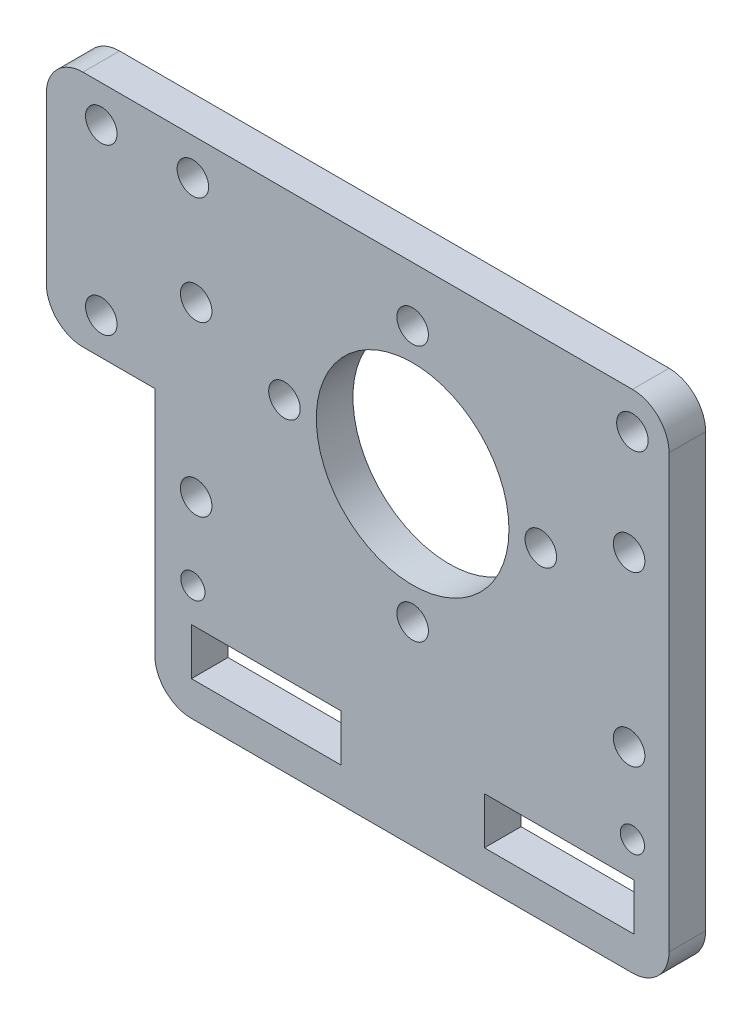
ISO-10303-21;
HEADER;
FILE_DESCRIPTION(('STEP AP214'),'2;1');
FILE_NAME('part.step','',(''),(''),'','','');
FILE_SCHEMA(('AUTOMOTIVE_DESIGN { 1 0 10303 214 1 1 1 1 }'));
ENDSEC;
DATA;
#1=APPLICATION_CONTEXT('core data for automotive mechanical design processes');
#2=APPLICATION_PROTOCOL_DEFINITION('international standard','automotive_design',2000,#1);
#3=PRODUCT_CONTEXT('',#1,'mechanical');
#4=PRODUCT('Part','Part','',(#3));
#5=PRODUCT_RELATED_PRODUCT_CATEGORY('part','',(#4));
#6=PRODUCT_DEFINITION_FORMATION('','',#4);
#7=PRODUCT_DEFINITION_CONTEXT('part definition',#1,'design');
#8=PRODUCT_DEFINITION('design','',#6,#7);
#9=PRODUCT_DEFINITION_SHAPE('','',#8);
#10=(LENGTH_UNIT() NAMED_UNIT(*) SI_UNIT(.MILLI.,.METRE.));
#11=(NAMED_UNIT(*) PLANE_ANGLE_UNIT() SI_UNIT($,.RADIAN.));
#12=(NAMED_UNIT(*) SI_UNIT($,.STERADIAN.) SOLID_ANGLE_UNIT());
#13=UNCERTAINTY_MEASURE_WITH_UNIT(LENGTH_MEASURE(1.E-05),#10,'distance_accuracy_value','');
#14=(GEOMETRIC_REPRESENTATION_CONTEXT(3) GLOBAL_UNCERTAINTY_ASSIGNED_CONTEXT((#13)) GLOBAL_UNIT_ASSIGNED_CONTEXT((#10,
#11,#12)) REPRESENTATION_CONTEXT('',''));
#15=CARTESIAN_POINT('',(0.,0.,0.));
#16=DIRECTION('',(0.,0.,1.));
#17=DIRECTION('',(1.,0.,0.));
#18=AXIS2_PLACEMENT_3D('',#15,#16,#17);
#19=CARTESIAN_POINT('',(0.,-44.,5.));
#20=DIRECTION('',(0.,1.,0.));
#21=DIRECTION('',(0.,0.,1.));
#22=AXIS2_PLACEMENT_3D('',#19,#20,#21);
#23=PLANE('',#22);
#24=DIRECTION('',(1.,0.,0.));
#25=VECTOR('',#24,1.);
#26=CARTESIAN_POINT('',(0.,-44.,5.));
#27=LINE('',#26,#25);
#28=CARTESIAN_POINT('',(-30.2,-44.,5.));
#29=VERTEX_POINT('',#28);
#30=CARTESIAN_POINT('',(30.,-44.,5.));
#31=VERTEX_POINT('',#30);
#32=EDGE_CURVE('E278',#29,#31,#27,.T.);
#33=ORIENTED_EDGE('',*,*,#32,.F.);
#34=DIRECTION('',(0.,0.,1.));
#35=VECTOR('',#34,1.);
#36=CARTESIAN_POINT('',(-30.2,-44.,5.));
#37=LINE('',#36,#35);
#38=CARTESIAN_POINT('',(-30.2,-44.,0.));
#39=VERTEX_POINT('',#38);
#40=EDGE_CURVE('E463',#29,#39,#37,.F.);
#41=ORIENTED_EDGE('',*,*,#40,.T.);
#42=DIRECTION('',(1.,0.,0.));
#43=VECTOR('',#42,1.);
#44=CARTESIAN_POINT('',(0.,-44.,0.));
#45=LINE('',#44,#43);
#46=CARTESIAN_POINT('',(30.,-44.,0.));
#47=VERTEX_POINT('',#46);
#48=EDGE_CURVE('E386',#39,#47,#45,.T.);
#49=ORIENTED_EDGE('',*,*,#48,.T.);
#50=DIRECTION('',(0.,0.,-1.));
#51=VECTOR('',#50,1.);
#52=CARTESIAN_POINT('',(30.,-44.,5.));
#53=LINE('',#52,#51);
#54=EDGE_CURVE('E460',#47,#31,#53,.F.);
#55=ORIENTED_EDGE('',*,*,#54,.T.);
#56=EDGE_LOOP('',(#33,#41,#49,#55));
#57=FACE_BOUND('',#56,.T.);
#58=ADVANCED_FACE('F41',(#57),#23,.F.);
#59=CARTESIAN_POINT('',(35.,0.,5.));
#60=DIRECTION('',(-1.,0.,0.));
#61=DIRECTION('',(0.,-1.,0.));
#62=AXIS2_PLACEMENT_3D('',#59,#60,#61);
#63=PLANE('',#62);
#64=DIRECTION('',(0.,1.,0.));
#65=VECTOR('',#64,1.);
#66=CARTESIAN_POINT('',(35.,0.,5.));
#67=LINE('',#66,#65);
#68=CARTESIAN_POINT('',(35.,-39.,5.));
#69=VERTEX_POINT('',#68);
#70=CARTESIAN_POINT('',(35.,20.,5.));
#71=VERTEX_POINT('',#70);
#72=EDGE_CURVE('E282',#69,#71,#67,.T.);
#73=ORIENTED_EDGE('',*,*,#72,.F.);
#74=DIRECTION('',(0.,0.,-1.));
#75=VECTOR('',#74,1.);
#76=CARTESIAN_POINT('',(35.,-39.,5.));
#77=LINE('',#76,#75);
#78=CARTESIAN_POINT('',(35.,-39.,0.));
#79=VERTEX_POINT('',#78);
#80=EDGE_CURVE('E482',#69,#79,#77,.T.);
#81=ORIENTED_EDGE('',*,*,#80,.T.);
#82=DIRECTION('',(0.,1.,0.));
#83=VECTOR('',#82,1.);
#84=CARTESIAN_POINT('',(35.,0.,0.));
#85=LINE('',#84,#83);
#86=CARTESIAN_POINT('',(35.,20.,0.));
#87=VERTEX_POINT('',#86);
#88=EDGE_CURVE('E390',#79,#87,#85,.T.);
#89=ORIENTED_EDGE('',*,*,#88,.T.);
#90=DIRECTION('',(0.,0.,-1.));
#91=VECTOR('',#90,1.);
#92=CARTESIAN_POINT('',(35.,20.,5.));
#93=LINE('',#92,#91);
#94=EDGE_CURVE('E479',#87,#71,#93,.F.);
#95=ORIENTED_EDGE('',*,*,#94,.T.);
#96=EDGE_LOOP('',(#73,#81,#89,#95));
#97=FACE_BOUND('',#96,.T.);
#98=ADVANCED_FACE('F522',(#97),#63,.F.);
#99=CARTESIAN_POINT('',(0.,25.,5.));
#100=DIRECTION('',(0.,1.,0.));
#101=DIRECTION('',(0.,0.,1.));
#102=AXIS2_PLACEMENT_3D('',#99,#100,#101);
#103=PLANE('',#102);
#104=DIRECTION('',(1.,0.,0.));
#105=VECTOR('',#104,1.);
#106=CARTESIAN_POINT('',(0.,25.,5.));
#107=LINE('',#106,#105);
#108=CARTESIAN_POINT('',(-45.,25.,5.));
#109=VERTEX_POINT('',#108);
#110=CARTESIAN_POINT('',(30.,25.,5.));
#111=VERTEX_POINT('',#110);
#112=EDGE_CURVE('E286',#109,#111,#107,.T.);
#113=ORIENTED_EDGE('',*,*,#112,.T.);
#114=DIRECTION('',(0.,0.,-1.));
#115=VECTOR('',#114,1.);
#116=CARTESIAN_POINT('',(30.,25.,0.));
#117=LINE('',#116,#115);
#118=CARTESIAN_POINT('',(30.,25.,0.));
#119=VERTEX_POINT('',#118);
#120=EDGE_CURVE('E488',#111,#119,#117,.T.);
#121=ORIENTED_EDGE('',*,*,#120,.T.);
#122=DIRECTION('',(1.,0.,0.));
#123=VECTOR('',#122,1.);
#124=CARTESIAN_POINT('',(0.,25.,0.));
#125=LINE('',#124,#123);
#126=CARTESIAN_POINT('',(-45.,25.,0.));
#127=VERTEX_POINT('',#126);
#128=EDGE_CURVE('E393',#127,#119,#125,.T.);
#129=ORIENTED_EDGE('',*,*,#128,.F.);
#130=DIRECTION('',(0.,0.,-1.));
#131=VECTOR('',#130,1.);
#132=CARTESIAN_POINT('',(-45.,25.,5.));
#133=LINE('',#132,#131);
#134=EDGE_CURVE('E485',#127,#109,#133,.F.);
#135=ORIENTED_EDGE('',*,*,#134,.T.);
#136=EDGE_LOOP('',(#113,#121,#129,#135));
#137=FACE_BOUND('',#136,.T.);
#138=ADVANCED_FACE('F514',(#137),#103,.T.);
#139=CARTESIAN_POINT('',(0.,-32.9,5.));
#140=DIRECTION('',(0.,-1.,0.));
#141=DIRECTION('',(1.,0.,0.));
#142=AXIS2_PLACEMENT_3D('',#139,#140,#141);
#143=PLANE('',#142);
#144=DIRECTION('',(-1.,0.,0.));
#145=VECTOR('',#144,1.);
#146=CARTESIAN_POINT('',(0.,-32.9,0.));
#147=LINE('',#146,#145);
#148=CARTESIAN_POINT('',(-9.80000000000001,-32.9,0.));
#149=VERTEX_POINT('',#148);
#150=CARTESIAN_POINT('',(-30.2,-32.9,0.));
#151=VERTEX_POINT('',#150);
#152=EDGE_CURVE('E370',#149,#151,#147,.T.);
#153=ORIENTED_EDGE('',*,*,#152,.F.);
#154=DIRECTION('',(0.,0.,-1.));
#155=VECTOR('',#154,1.);
#156=CARTESIAN_POINT('',(-9.80000000000001,-32.9,5.));
#157=LINE('',#156,#155);
#158=CARTESIAN_POINT('',(-9.80000000000001,-32.9,5.));
#159=VERTEX_POINT('',#158);
#160=EDGE_CURVE('E430',#159,#149,#157,.T.);
#161=ORIENTED_EDGE('',*,*,#160,.F.);
#162=DIRECTION('',(-1.,0.,0.));
#163=VECTOR('',#162,1.);
#164=CARTESIAN_POINT('',(0.,-32.9,5.));
#165=LINE('',#164,#163);
#166=CARTESIAN_POINT('',(-30.2,-32.9,5.));
#167=VERTEX_POINT('',#166);
#168=EDGE_CURVE('E263',#159,#167,#165,.T.);
#169=ORIENTED_EDGE('',*,*,#168,.T.);
#170=DIRECTION('',(0.,0.,-1.));
#171=VECTOR('',#170,1.);
#172=CARTESIAN_POINT('',(-30.2,-32.9,5.));
#173=LINE('',#172,#171);
#174=EDGE_CURVE('E419',#167,#151,#173,.T.);
#175=ORIENTED_EDGE('',*,*,#174,.T.);
#176=EDGE_LOOP('',(#153,#161,#169,#175));
#177=FACE_BOUND('',#176,.T.);
#178=ADVANCED_FACE('F563',(#177),#143,.T.);
#179=CARTESIAN_POINT('',(-9.80000000000001,0.,5.));
#180=DIRECTION('',(-1.,0.,0.));
#181=DIRECTION('',(0.,0.,1.));
#182=AXIS2_PLACEMENT_3D('',#179,#180,#181);
#183=PLANE('',#182);
#184=DIRECTION('',(0.,1.,0.));
#185=VECTOR('',#184,1.);
#186=CARTESIAN_POINT('',(-9.80000000000001,0.,0.));
#187=LINE('',#186,#185);
#188=CARTESIAN_POINT('',(-9.80000000000001,-39.3,0.));
#189=VERTEX_POINT('',#188);
#190=EDGE_CURVE('E374',#189,#149,#187,.T.);
#191=ORIENTED_EDGE('',*,*,#190,.F.);
#192=DIRECTION('',(0.,0.,-1.));
#193=VECTOR('',#192,1.);
#194=CARTESIAN_POINT('',(-9.80000000000001,-39.3,5.));
#195=LINE('',#194,#193);
#196=CARTESIAN_POINT('',(-9.80000000000001,-39.3,5.));
#197=VERTEX_POINT('',#196);
#198=EDGE_CURVE('E427',#197,#189,#195,.T.);
#199=ORIENTED_EDGE('',*,*,#198,.F.);
#200=DIRECTION('',(0.,1.,0.));
#201=VECTOR('',#200,1.);
#202=CARTESIAN_POINT('',(-9.80000000000001,0.,5.));
#203=LINE('',#202,#201);
#204=EDGE_CURVE('E267',#197,#159,#203,.T.);
#205=ORIENTED_EDGE('',*,*,#204,.T.);
#206=ORIENTED_EDGE('',*,*,#160,.T.);
#207=EDGE_LOOP('',(#191,#199,#205,#206));
#208=FACE_BOUND('',#207,.T.);
#209=ADVANCED_FACE('F559',(#208),#183,.T.);
#210=CARTESIAN_POINT('',(0.,-39.3,5.));
#211=DIRECTION('',(0.,-1.,0.));
#212=DIRECTION('',(1.,0.,0.));
#213=AXIS2_PLACEMENT_3D('',#210,#211,#212);
#214=PLANE('',#213);
#215=DIRECTION('',(-1.,0.,0.));
#216=VECTOR('',#215,1.);
#217=CARTESIAN_POINT('',(0.,-39.3,0.));
#218=LINE('',#217,#216);
#219=CARTESIAN_POINT('',(-30.2,-39.3,0.));
#220=VERTEX_POINT('',#219);
#221=EDGE_CURVE('E378',#189,#220,#218,.T.);
#222=ORIENTED_EDGE('',*,*,#221,.T.);
#223=DIRECTION('',(0.,0.,-1.));
#224=VECTOR('',#223,1.);
#225=CARTESIAN_POINT('',(-30.2,-39.3,5.));
#226=LINE('',#225,#224);
#227=CARTESIAN_POINT('',(-30.2,-39.3,5.));
#228=VERTEX_POINT('',#227);
#229=EDGE_CURVE('E422',#228,#220,#226,.T.);
#230=ORIENTED_EDGE('',*,*,#229,.F.);
#231=DIRECTION('',(-1.,0.,0.));
#232=VECTOR('',#231,1.);
#233=CARTESIAN_POINT('',(0.,-39.3,5.));
#234=LINE('',#233,#232);
#235=EDGE_CURVE('E271',#197,#228,#234,.T.);
#236=ORIENTED_EDGE('',*,*,#235,.F.);
#237=ORIENTED_EDGE('',*,*,#198,.T.);
#238=EDGE_LOOP('',(#222,#230,#236,#237));
#239=FACE_BOUND('',#238,.T.);
#240=ADVANCED_FACE('F555',(#239),#214,.F.);
#241=CARTESIAN_POINT('',(30.2,0.,5.));
#242=DIRECTION('',(-1.,0.,0.));
#243=DIRECTION('',(0.,0.,1.));
#244=AXIS2_PLACEMENT_3D('',#241,#242,#243);
#245=PLANE('',#244);
#246=DIRECTION('',(0.,1.,0.));
#247=VECTOR('',#246,1.);
#248=CARTESIAN_POINT('',(30.2,0.,0.));
#249=LINE('',#248,#247);
#250=CARTESIAN_POINT('',(30.2,-39.3,0.));
#251=VERTEX_POINT('',#250);
#252=CARTESIAN_POINT('',(30.2,-32.9,0.));
#253=VERTEX_POINT('',#252);
#254=EDGE_CURVE('E354',#251,#253,#249,.T.);
#255=ORIENTED_EDGE('',*,*,#254,.F.);
#256=DIRECTION('',(0.,0.,-1.));
#257=VECTOR('',#256,1.);
#258=CARTESIAN_POINT('',(30.2,-39.3,5.));
#259=LINE('',#258,#257);
#260=CARTESIAN_POINT('',(30.2,-39.3,5.));
#261=VERTEX_POINT('',#260);
#262=EDGE_CURVE('E423',#261,#251,#259,.T.);
#263=ORIENTED_EDGE('',*,*,#262,.F.);
#264=DIRECTION('',(0.,1.,0.));
#265=VECTOR('',#264,1.);
#266=CARTESIAN_POINT('',(30.2,0.,5.));
#267=LINE('',#266,#265);
#268=CARTESIAN_POINT('',(30.2,-32.9,5.));
#269=VERTEX_POINT('',#268);
#270=EDGE_CURVE('E248',#261,#269,#267,.T.);
#271=ORIENTED_EDGE('',*,*,#270,.T.);
#272=DIRECTION('',(0.,0.,-1.));
#273=VECTOR('',#272,1.);
#274=CARTESIAN_POINT('',(30.2,-32.9,5.));
#275=LINE('',#274,#273);
#276=EDGE_CURVE('E314',#269,#253,#275,.T.);
#277=ORIENTED_EDGE('',*,*,#276,.T.);
#278=EDGE_LOOP('',(#255,#263,#271,#277));
#279=FACE_BOUND('',#278,.T.);
#280=ADVANCED_FACE('F558',(#279),#245,.T.);
#281=CARTESIAN_POINT('',(0.,-39.3,5.));
#282=DIRECTION('',(0.,1.,0.));
#283=DIRECTION('',(0.,0.,1.));
#284=AXIS2_PLACEMENT_3D('',#281,#282,#283);
#285=PLANE('',#284);
#286=DIRECTION('',(1.,0.,0.));
#287=VECTOR('',#286,1.);
#288=CARTESIAN_POINT('',(0.,-39.3,0.));
#289=LINE('',#288,#287);
#290=CARTESIAN_POINT('',(9.80000000000003,-39.3,0.));
#291=VERTEX_POINT('',#290);
#292=EDGE_CURVE('E358',#291,#251,#289,.T.);
#293=ORIENTED_EDGE('',*,*,#292,.F.);
#294=DIRECTION('',(0.,0.,-1.));
#295=VECTOR('',#294,1.);
#296=CARTESIAN_POINT('',(9.80000000000003,-39.3,5.));
#297=LINE('',#296,#295);
#298=CARTESIAN_POINT('',(9.80000000000003,-39.3,5.));
#299=VERTEX_POINT('',#298);
#300=EDGE_CURVE('E439',#299,#291,#297,.T.);
#301=ORIENTED_EDGE('',*,*,#300,.F.);
#302=DIRECTION('',(1.,0.,0.));
#303=VECTOR('',#302,1.);
#304=CARTESIAN_POINT('',(0.,-39.3,5.));
#305=LINE('',#304,#303);
#306=EDGE_CURVE('E252',#299,#261,#305,.T.);
#307=ORIENTED_EDGE('',*,*,#306,.T.);
#308=ORIENTED_EDGE('',*,*,#262,.T.);
#309=EDGE_LOOP('',(#293,#301,#307,#308));
#310=FACE_BOUND('',#309,.T.);
#311=ADVANCED_FACE('F576',(#310),#285,.T.);
#312=CARTESIAN_POINT('',(9.80000000000003,0.,5.));
#313=DIRECTION('',(-1.,0.,0.));
#314=DIRECTION('',(0.,0.,1.));
#315=AXIS2_PLACEMENT_3D('',#312,#313,#314);
#316=PLANE('',#315);
#317=DIRECTION('',(0.,1.,0.));
#318=VECTOR('',#317,1.);
#319=CARTESIAN_POINT('',(9.80000000000003,0.,0.));
#320=LINE('',#319,#318);
#321=CARTESIAN_POINT('',(9.80000000000003,-32.9,0.));
#322=VERTEX_POINT('',#321);
#323=EDGE_CURVE('E362',#291,#322,#320,.T.);
#324=ORIENTED_EDGE('',*,*,#323,.T.);
#325=DIRECTION('',(0.,0.,-1.));
#326=VECTOR('',#325,1.);
#327=CARTESIAN_POINT('',(9.80000000000003,-32.9,5.));
#328=LINE('',#327,#326);
#329=CARTESIAN_POINT('',(9.80000000000003,-32.9,5.));
#330=VERTEX_POINT('',#329);
#331=EDGE_CURVE('E435',#330,#322,#328,.T.);
#332=ORIENTED_EDGE('',*,*,#331,.F.);
#333=DIRECTION('',(0.,1.,0.));
#334=VECTOR('',#333,1.);
#335=CARTESIAN_POINT('',(9.80000000000003,0.,5.));
#336=LINE('',#335,#334);
#337=EDGE_CURVE('E256',#299,#330,#336,.T.);
#338=ORIENTED_EDGE('',*,*,#337,.F.);
#339=ORIENTED_EDGE('',*,*,#300,.T.);
#340=EDGE_LOOP('',(#324,#332,#338,#339));
#341=FACE_BOUND('',#340,.T.);
#342=ADVANCED_FACE('F572',(#341),#316,.F.);
#343=CARTESIAN_POINT('',(-42.5,-2.5,5.));
#344=DIRECTION('',(0.,0.,-1.));
#345=DIRECTION('',(-1.,0.,0.));
#346=AXIS2_PLACEMENT_3D('',#343,#344,#345);
#347=CYLINDRICAL_SURFACE('',#346,2.15);
#348=CARTESIAN_POINT('',(-42.5,-2.5,5.));
#349=DIRECTION('',(0.,0.,1.));
#350=DIRECTION('',(1.,0.,0.));
#351=AXIS2_PLACEMENT_3D('',#348,#349,#350);
#352=CIRCLE('',#351,2.15);
#353=CARTESIAN_POINT('',(-40.35,-2.5,5.));
#354=VERTEX_POINT('',#353);
#355=EDGE_CURVE('E306',#354,#354,#352,.T.);
#356=ORIENTED_EDGE('',*,*,#355,.T.);
#357=EDGE_LOOP('',(#356));
#358=FACE_BOUND('',#357,.T.);
#359=CARTESIAN_POINT('',(-42.5,-2.5,0.));
#360=DIRECTION('',(0.,0.,1.));
#361=DIRECTION('',(1.,0.,0.));
#362=AXIS2_PLACEMENT_3D('',#359,#360,#361);
#363=CIRCLE('',#362,2.15);
#364=CARTESIAN_POINT('',(-40.35,-2.5,0.));
#365=VERTEX_POINT('',#364);
#366=EDGE_CURVE('E412',#365,#365,#363,.T.);
#367=ORIENTED_EDGE('',*,*,#366,.F.);
#368=EDGE_LOOP('',(#367));
#369=FACE_BOUND('',#368,.T.);
#370=ADVANCED_FACE('F575',(#358,#369),#347,.F.);
#371=CARTESIAN_POINT('',(-29.55,-17.5,5.));
#372=DIRECTION('',(0.,0.,-1.));
#373=DIRECTION('',(-1.,0.,0.));
#374=AXIS2_PLACEMENT_3D('',#371,#372,#373);
#375=CYLINDRICAL_SURFACE('',#374,2.15);
#376=CARTESIAN_POINT('',(-29.55,-17.5,5.));
#377=DIRECTION('',(0.,0.,1.));
#378=DIRECTION('',(1.,0.,0.));
#379=AXIS2_PLACEMENT_3D('',#376,#377,#378);
#380=CIRCLE('',#379,2.15);
#381=CARTESIAN_POINT('',(-27.4,-17.5,5.));
#382=VERTEX_POINT('',#381);
#383=EDGE_CURVE('E302',#382,#382,#380,.F.);
#384=ORIENTED_EDGE('',*,*,#383,.F.);
#385=EDGE_LOOP('',(#384));
#386=FACE_BOUND('',#385,.T.);
#387=CARTESIAN_POINT('',(-29.55,-17.5,0.));
#388=DIRECTION('',(0.,0.,1.));
#389=DIRECTION('',(1.,0.,0.));
#390=AXIS2_PLACEMENT_3D('',#387,#388,#389);
#391=CIRCLE('',#390,2.15);
#392=CARTESIAN_POINT('',(-27.4,-17.5,0.));
#393=VERTEX_POINT('',#392);
#394=EDGE_CURVE('E408',#393,#393,#391,.F.);
#395=ORIENTED_EDGE('',*,*,#394,.T.);
#396=EDGE_LOOP('',(#395));
#397=FACE_BOUND('',#396,.T.);
#398=ADVANCED_FACE('F681',(#386,#397),#375,.F.);
#399=CARTESIAN_POINT('',(-30.,20.,5.));
#400=DIRECTION('',(0.,0.,-1.));
#401=DIRECTION('',(-1.,0.,0.));
#402=AXIS2_PLACEMENT_3D('',#399,#400,#401);
#403=CYLINDRICAL_SURFACE('',#402,2.15);
#404=CARTESIAN_POINT('',(-30.,20.,5.));
#405=DIRECTION('',(0.,0.,1.));
#406=DIRECTION('',(1.,0.,0.));
#407=AXIS2_PLACEMENT_3D('',#404,#405,#406);
#408=CIRCLE('',#407,2.15);
#409=CARTESIAN_POINT('',(-27.85,20.,5.));
#410=VERTEX_POINT('',#409);
#411=EDGE_CURVE('E298',#410,#410,#408,.F.);
#412=ORIENTED_EDGE('',*,*,#411,.F.);
#413=EDGE_LOOP('',(#412));
#414=FACE_BOUND('',#413,.T.);
#415=CARTESIAN_POINT('',(-30.,20.,0.));
#416=DIRECTION('',(0.,0.,1.));
#417=DIRECTION('',(1.,0.,0.));
#418=AXIS2_PLACEMENT_3D('',#415,#416,#417);
#419=CIRCLE('',#418,2.15);
#420=CARTESIAN_POINT('',(-27.85,20.,0.));
#421=VERTEX_POINT('',#420);
#422=EDGE_CURVE('E404',#421,#421,#419,.F.);
#423=ORIENTED_EDGE('',*,*,#422,.T.);
#424=EDGE_LOOP('',(#423));
#425=FACE_BOUND('',#424,.T.);
#426=ADVANCED_FACE('F688',(#414,#425),#403,.F.);
#427=CARTESIAN_POINT('',(30.,20.,5.));
#428=DIRECTION('',(0.,0.,-1.));
#429=DIRECTION('',(-1.,0.,0.));
#430=AXIS2_PLACEMENT_3D('',#427,#428,#429);
#431=CYLINDRICAL_SURFACE('',#430,2.15000000000001);
#432=CARTESIAN_POINT('',(30.,20.,5.));
#433=DIRECTION('',(0.,0.,1.));
#434=DIRECTION('',(1.,0.,0.));
#435=AXIS2_PLACEMENT_3D('',#432,#433,#434);
#436=CIRCLE('',#435,2.15000000000001);
#437=CARTESIAN_POINT('',(32.15,20.,5.));
#438=VERTEX_POINT('',#437);
#439=EDGE_CURVE('E294',#438,#438,#436,.T.);
#440=ORIENTED_EDGE('',*,*,#439,.T.);
#441=EDGE_LOOP('',(#440));
#442=FACE_BOUND('',#441,.T.);
#443=CARTESIAN_POINT('',(30.,20.,0.));
#444=DIRECTION('',(0.,0.,1.));
#445=DIRECTION('',(1.,0.,0.));
#446=AXIS2_PLACEMENT_3D('',#443,#444,#445);
#447=CIRCLE('',#446,2.15000000000001);
#448=CARTESIAN_POINT('',(32.15,20.,0.));
#449=VERTEX_POINT('',#448);
#450=EDGE_CURVE('E400',#449,#449,#447,.T.);
#451=ORIENTED_EDGE('',*,*,#450,.F.);
#452=EDGE_LOOP('',(#451));
#453=FACE_BOUND('',#452,.T.);
#454=ADVANCED_FACE('F694',(#442,#453),#431,.F.);
#455=CARTESIAN_POINT('',(-50.,0.,5.));
#456=DIRECTION('',(-1.,0.,0.));
#457=DIRECTION('',(0.,-1.,0.));
#458=AXIS2_PLACEMENT_3D('',#455,#456,#457);
#459=PLANE('',#458);
#460=DIRECTION('',(0.,1.,0.));
#461=VECTOR('',#460,1.);
#462=CARTESIAN_POINT('',(-50.,0.,5.));
#463=LINE('',#462,#461);
#464=CARTESIAN_POINT('',(-50.,-2.5,5.));
#465=VERTEX_POINT('',#464);
#466=CARTESIAN_POINT('',(-50.,20.,5.));
#467=VERTEX_POINT('',#466);
#468=EDGE_CURVE('E290',#465,#467,#463,.T.);
#469=ORIENTED_EDGE('',*,*,#468,.T.);
#470=DIRECTION('',(0.,0.,-1.));
#471=VECTOR('',#470,1.);
#472=CARTESIAN_POINT('',(-50.,20.,5.));
#473=LINE('',#472,#471);
#474=CARTESIAN_POINT('',(-50.,20.,0.));
#475=VERTEX_POINT('',#474);
#476=EDGE_CURVE('E50',#467,#475,#473,.T.);
#477=ORIENTED_EDGE('',*,*,#476,.T.);
#478=DIRECTION('',(0.,1.,0.));
#479=VECTOR('',#478,1.);
#480=CARTESIAN_POINT('',(-50.,0.,0.));
#481=LINE('',#480,#479);
#482=CARTESIAN_POINT('',(-50.,-2.5,0.));
#483=VERTEX_POINT('',#482);
#484=EDGE_CURVE('E396',#483,#475,#481,.T.);
#485=ORIENTED_EDGE('',*,*,#484,.F.);
#486=DIRECTION('',(0.,0.,1.));
#487=VECTOR('',#486,1.);
#488=CARTESIAN_POINT('',(-50.,-2.5,5.));
#489=LINE('',#488,#487);
#490=EDGE_CURVE('E492',#483,#465,#489,.T.);
#491=ORIENTED_EDGE('',*,*,#490,.T.);
#492=EDGE_LOOP('',(#469,#477,#485,#491));
#493=FACE_BOUND('',#492,.T.);
#494=ADVANCED_FACE('F500',(#493),#459,.T.);
#495=CARTESIAN_POINT('',(-30.2,0.,5.));
#496=DIRECTION('',(-1.,0.,0.));
#497=DIRECTION('',(0.,0.,1.));
#498=AXIS2_PLACEMENT_3D('',#495,#496,#497);
#499=PLANE('',#498);
#500=DIRECTION('',(0.,1.,0.));
#501=VECTOR('',#500,1.);
#502=CARTESIAN_POINT('',(-30.2,0.,0.));
#503=LINE('',#502,#501);
#504=EDGE_CURVE('E382',#220,#151,#503,.T.);
#505=ORIENTED_EDGE('',*,*,#504,.T.);
#506=ORIENTED_EDGE('',*,*,#174,.F.);
#507=DIRECTION('',(0.,1.,0.));
#508=VECTOR('',#507,1.);
#509=CARTESIAN_POINT('',(-30.2,0.,5.));
#510=LINE('',#509,#508);
#511=EDGE_CURVE('E275',#228,#167,#510,.T.);
#512=ORIENTED_EDGE('',*,*,#511,.F.);
#513=ORIENTED_EDGE('',*,*,#229,.T.);
#514=EDGE_LOOP('',(#505,#506,#512,#513));
#515=FACE_BOUND('',#514,.T.);
#516=ADVANCED_FACE('F550',(#515),#499,.F.);
#517=CARTESIAN_POINT('',(0.,-32.9,5.));
#518=DIRECTION('',(0.,1.,0.));
#519=DIRECTION('',(0.,0.,1.));
#520=AXIS2_PLACEMENT_3D('',#517,#518,#519);
#521=PLANE('',#520);
#522=DIRECTION('',(1.,0.,0.));
#523=VECTOR('',#522,1.);
#524=CARTESIAN_POINT('',(0.,-32.9,0.));
#525=LINE('',#524,#523);
#526=EDGE_CURVE('E366',#322,#253,#525,.T.);
#527=ORIENTED_EDGE('',*,*,#526,.T.);
#528=ORIENTED_EDGE('',*,*,#276,.F.);
#529=DIRECTION('',(1.,0.,0.));
#530=VECTOR('',#529,1.);
#531=CARTESIAN_POINT('',(0.,-32.9,5.));
#532=LINE('',#531,#530);
#533=EDGE_CURVE('E260',#330,#269,#532,.T.);
#534=ORIENTED_EDGE('',*,*,#533,.F.);
#535=ORIENTED_EDGE('',*,*,#331,.T.);
#536=EDGE_LOOP('',(#527,#528,#534,#535));
#537=FACE_BOUND('',#536,.T.);
#538=ADVANCED_FACE('F553',(#537),#521,.F.);
#539=CARTESIAN_POINT('',(0.,0.,5.));
#540=DIRECTION('',(0.,0.,-1.));
#541=DIRECTION('',(-1.,0.,0.));
#542=AXIS2_PLACEMENT_3D('',#539,#540,#541);
#543=CYLINDRICAL_SURFACE('',#542,13.15);
#544=CARTESIAN_POINT('',(0.,0.,5.));
#545=DIRECTION('',(0.,0.,1.));
#546=DIRECTION('',(1.,0.,0.));
#547=AXIS2_PLACEMENT_3D('',#544,#545,#546);
#548=CIRCLE('',#547,13.15);
#549=CARTESIAN_POINT('',(13.15,0.,5.));
#550=VERTEX_POINT('',#549);
#551=EDGE_CURVE('E244',#550,#550,#548,.T.);
#552=ORIENTED_EDGE('',*,*,#551,.T.);
#553=EDGE_LOOP('',(#552));
#554=FACE_BOUND('',#553,.T.);
#555=CARTESIAN_POINT('',(0.,0.,0.));
#556=DIRECTION('',(0.,0.,1.));
#557=DIRECTION('',(1.,0.,0.));
#558=AXIS2_PLACEMENT_3D('',#555,#556,#557);
#559=CIRCLE('',#558,13.15);
#560=CARTESIAN_POINT('',(13.15,0.,0.));
#561=VERTEX_POINT('',#560);
#562=EDGE_CURVE('E350',#561,#561,#559,.T.);
#563=ORIENTED_EDGE('',*,*,#562,.F.);
#564=EDGE_LOOP('',(#563));
#565=FACE_BOUND('',#564,.T.);
#566=ADVANCED_FACE('F570',(#554,#565),#543,.F.);
#567=CARTESIAN_POINT('',(0.,17.5,5.));
#568=DIRECTION('',(0.,0.,-1.));
#569=DIRECTION('',(-1.,0.,0.));
#570=AXIS2_PLACEMENT_3D('',#567,#568,#569);
#571=CYLINDRICAL_SURFACE('',#570,2.15);
#572=CARTESIAN_POINT('',(0.,17.5,5.));
#573=DIRECTION('',(0.,0.,1.));
#574=DIRECTION('',(1.,0.,0.));
#575=AXIS2_PLACEMENT_3D('',#572,#573,#574);
#576=CIRCLE('',#575,2.15);
#577=CARTESIAN_POINT('',(2.15,17.5,5.));
#578=VERTEX_POINT('',#577);
#579=EDGE_CURVE('E240',#578,#578,#576,.T.);
#580=ORIENTED_EDGE('',*,*,#579,.T.);
#581=EDGE_LOOP('',(#580));
#582=FACE_BOUND('',#581,.T.);
#583=CARTESIAN_POINT('',(0.,17.5,0.));
#584=DIRECTION('',(0.,0.,1.));
#585=DIRECTION('',(1.,0.,0.));
#586=AXIS2_PLACEMENT_3D('',#583,#584,#585);
#587=CIRCLE('',#586,2.15);
#588=CARTESIAN_POINT('',(2.15,17.5,0.));
#589=VERTEX_POINT('',#588);
#590=EDGE_CURVE('E346',#589,#589,#587,.T.);
#591=ORIENTED_EDGE('',*,*,#590,.F.);
#592=EDGE_LOOP('',(#591));
#593=FACE_BOUND('',#592,.T.);
#594=ADVANCED_FACE('F586',(#582,#593),#571,.F.);
#595=CARTESIAN_POINT('',(17.5,0.,5.));
#596=DIRECTION('',(0.,0.,-1.));
#597=DIRECTION('',(-1.,0.,0.));
#598=AXIS2_PLACEMENT_3D('',#595,#596,#597);
#599=CYLINDRICAL_SURFACE('',#598,2.15);
#600=CARTESIAN_POINT('',(17.5,0.,5.));
#601=DIRECTION('',(0.,0.,1.));
#602=DIRECTION('',(1.,0.,0.));
#603=AXIS2_PLACEMENT_3D('',#600,#601,#602);
#604=CIRCLE('',#603,2.15);
#605=CARTESIAN_POINT('',(19.65,0.,5.));
#606=VERTEX_POINT('',#605);
#607=EDGE_CURVE('E236',#606,#606,#604,.T.);
#608=ORIENTED_EDGE('',*,*,#607,.T.);
#609=EDGE_LOOP('',(#608));
#610=FACE_BOUND('',#609,.T.);
#611=CARTESIAN_POINT('',(17.5,0.,0.));
#612=DIRECTION('',(0.,0.,1.));
#613=DIRECTION('',(1.,0.,0.));
#614=AXIS2_PLACEMENT_3D('',#611,#612,#613);
#615=CIRCLE('',#614,2.15);
#616=CARTESIAN_POINT('',(19.65,0.,0.));
#617=VERTEX_POINT('',#616);
#618=EDGE_CURVE('E342',#617,#617,#615,.T.);
#619=ORIENTED_EDGE('',*,*,#618,.F.);
#620=EDGE_LOOP('',(#619));
#621=FACE_BOUND('',#620,.T.);
#622=ADVANCED_FACE('F590',(#610,#621),#599,.F.);
#623=CARTESIAN_POINT('',(0.,-17.5,5.));
#624=DIRECTION('',(0.,0.,-1.));
#625=DIRECTION('',(-1.,0.,0.));
#626=AXIS2_PLACEMENT_3D('',#623,#624,#625);
#627=CYLINDRICAL_SURFACE('',#626,2.15);
#628=CARTESIAN_POINT('',(0.,-17.5,5.));
#629=DIRECTION('',(0.,0.,1.));
#630=DIRECTION('',(1.,0.,0.));
#631=AXIS2_PLACEMENT_3D('',#628,#629,#630);
#632=CIRCLE('',#631,2.15);
#633=CARTESIAN_POINT('',(2.15,-17.5,5.));
#634=VERTEX_POINT('',#633);
#635=EDGE_CURVE('E232',#634,#634,#632,.T.);
#636=ORIENTED_EDGE('',*,*,#635,.T.);
#637=EDGE_LOOP('',(#636));
#638=FACE_BOUND('',#637,.T.);
#639=CARTESIAN_POINT('',(0.,-17.5,0.));
#640=DIRECTION('',(0.,0.,1.));
#641=DIRECTION('',(1.,0.,0.));
#642=AXIS2_PLACEMENT_3D('',#639,#640,#641);
#643=CIRCLE('',#642,2.15);
#644=CARTESIAN_POINT('',(2.15,-17.5,0.));
#645=VERTEX_POINT('',#644);
#646=EDGE_CURVE('E338',#645,#645,#643,.T.);
#647=ORIENTED_EDGE('',*,*,#646,.F.);
#648=EDGE_LOOP('',(#647));
#649=FACE_BOUND('',#648,.T.);
#650=ADVANCED_FACE('F594',(#638,#649),#627,.F.);
#651=CARTESIAN_POINT('',(-17.5,0.,5.));
#652=DIRECTION('',(0.,0.,-1.));
#653=DIRECTION('',(-1.,0.,0.));
#654=AXIS2_PLACEMENT_3D('',#651,#652,#653);
#655=CYLINDRICAL_SURFACE('',#654,2.15);
#656=CARTESIAN_POINT('',(-17.5,0.,5.));
#657=DIRECTION('',(0.,0.,1.));
#658=DIRECTION('',(1.,0.,0.));
#659=AXIS2_PLACEMENT_3D('',#656,#657,#658);
#660=CIRCLE('',#659,2.15);
#661=CARTESIAN_POINT('',(-15.35,0.,5.));
#662=VERTEX_POINT('',#661);
#663=EDGE_CURVE('E228',#662,#662,#660,.T.);
#664=ORIENTED_EDGE('',*,*,#663,.T.);
#665=EDGE_LOOP('',(#664));
#666=FACE_BOUND('',#665,.T.);
#667=CARTESIAN_POINT('',(-17.5,0.,0.));
#668=DIRECTION('',(0.,0.,1.));
#669=DIRECTION('',(1.,0.,0.));
#670=AXIS2_PLACEMENT_3D('',#667,#668,#669);
#671=CIRCLE('',#670,2.15);
#672=CARTESIAN_POINT('',(-15.35,0.,0.));
#673=VERTEX_POINT('',#672);
#674=EDGE_CURVE('E334',#673,#673,#671,.T.);
#675=ORIENTED_EDGE('',*,*,#674,.F.);
#676=EDGE_LOOP('',(#675));
#677=FACE_BOUND('',#676,.T.);
#678=ADVANCED_FACE('F598',(#666,#677),#655,.F.);
#679=CARTESIAN_POINT('',(30.,-28.2,5.));
#680=DIRECTION('',(0.,0.,-1.));
#681=DIRECTION('',(-1.,0.,0.));
#682=AXIS2_PLACEMENT_3D('',#679,#680,#681);
#683=CYLINDRICAL_SURFACE('',#682,1.65);
#684=CARTESIAN_POINT('',(30.,-28.2,5.));
#685=DIRECTION('',(0.,0.,1.));
#686=DIRECTION('',(1.,0.,0.));
#687=AXIS2_PLACEMENT_3D('',#684,#685,#686);
#688=CIRCLE('',#687,1.65);
#689=CARTESIAN_POINT('',(31.65,-28.2,5.));
#690=VERTEX_POINT('',#689);
#691=EDGE_CURVE('E224',#690,#690,#688,.T.);
#692=ORIENTED_EDGE('',*,*,#691,.T.);
#693=EDGE_LOOP('',(#692));
#694=FACE_BOUND('',#693,.T.);
#695=CARTESIAN_POINT('',(30.,-28.2,0.));
#696=DIRECTION('',(0.,0.,1.));
#697=DIRECTION('',(1.,0.,0.));
#698=AXIS2_PLACEMENT_3D('',#695,#696,#697);
#699=CIRCLE('',#698,1.65);
#700=CARTESIAN_POINT('',(31.65,-28.2,0.));
#701=VERTEX_POINT('',#700);
#702=EDGE_CURVE('E330',#701,#701,#699,.T.);
#703=ORIENTED_EDGE('',*,*,#702,.F.);
#704=EDGE_LOOP('',(#703));
#705=FACE_BOUND('',#704,.T.);
#706=ADVANCED_FACE('F602',(#694,#705),#683,.F.);
#707=CARTESIAN_POINT('',(-30.,-28.2,5.));
#708=DIRECTION('',(0.,0.,-1.));
#709=DIRECTION('',(-1.,0.,0.));
#710=AXIS2_PLACEMENT_3D('',#707,#708,#709);
#711=CYLINDRICAL_SURFACE('',#710,1.64999999999998);
#712=CARTESIAN_POINT('',(-30.,-28.2,5.));
#713=DIRECTION('',(0.,0.,1.));
#714=DIRECTION('',(1.,0.,0.));
#715=AXIS2_PLACEMENT_3D('',#712,#713,#714);
#716=CIRCLE('',#715,1.64999999999998);
#717=CARTESIAN_POINT('',(-28.35,-28.2,5.));
#718=VERTEX_POINT('',#717);
#719=EDGE_CURVE('E220',#718,#718,#716,.F.);
#720=ORIENTED_EDGE('',*,*,#719,.F.);
#721=EDGE_LOOP('',(#720));
#722=FACE_BOUND('',#721,.T.);
#723=CARTESIAN_POINT('',(-30.,-28.2,0.));
#724=DIRECTION('',(0.,0.,1.));
#725=DIRECTION('',(1.,0.,0.));
#726=AXIS2_PLACEMENT_3D('',#723,#724,#725);
#727=CIRCLE('',#726,1.64999999999998);
#728=CARTESIAN_POINT('',(-28.35,-28.2,0.));
#729=VERTEX_POINT('',#728);
#730=EDGE_CURVE('E326',#729,#729,#727,.F.);
#731=ORIENTED_EDGE('',*,*,#730,.T.);
#732=EDGE_LOOP('',(#731));
#733=FACE_BOUND('',#732,.T.);
#734=ADVANCED_FACE('F606',(#722,#733),#711,.F.);
#735=CARTESIAN_POINT('',(29.55,-17.5,5.));
#736=DIRECTION('',(0.,0.,-1.));
#737=DIRECTION('',(-1.,0.,0.));
#738=AXIS2_PLACEMENT_3D('',#735,#736,#737);
#739=CYLINDRICAL_SURFACE('',#738,2.15);
#740=CARTESIAN_POINT('',(29.55,-17.5,5.));
#741=DIRECTION('',(0.,0.,1.));
#742=DIRECTION('',(1.,0.,0.));
#743=AXIS2_PLACEMENT_3D('',#740,#741,#742);
#744=CIRCLE('',#743,2.15);
#745=CARTESIAN_POINT('',(31.7,-17.5,5.));
#746=VERTEX_POINT('',#745);
#747=EDGE_CURVE('E216',#746,#746,#744,.T.);
#748=ORIENTED_EDGE('',*,*,#747,.T.);
#749=EDGE_LOOP('',(#748));
#750=FACE_BOUND('',#749,.T.);
#751=CARTESIAN_POINT('',(29.55,-17.5,0.));
#752=DIRECTION('',(0.,0.,1.));
#753=DIRECTION('',(1.,0.,0.));
#754=AXIS2_PLACEMENT_3D('',#751,#752,#753);
#755=CIRCLE('',#754,2.15);
#756=CARTESIAN_POINT('',(31.7,-17.5,0.));
#757=VERTEX_POINT('',#756);
#758=EDGE_CURVE('E322',#757,#757,#755,.T.);
#759=ORIENTED_EDGE('',*,*,#758,.F.);
#760=EDGE_LOOP('',(#759));
#761=FACE_BOUND('',#760,.T.);
#762=ADVANCED_FACE('F610',(#750,#761),#739,.F.);
#763=CARTESIAN_POINT('',(29.55,5.5,5.));
#764=DIRECTION('',(0.,0.,-1.));
#765=DIRECTION('',(-1.,0.,0.));
#766=AXIS2_PLACEMENT_3D('',#763,#764,#765);
#767=CYLINDRICAL_SURFACE('',#766,2.15);
#768=CARTESIAN_POINT('',(29.55,5.5,5.));
#769=DIRECTION('',(0.,0.,1.));
#770=DIRECTION('',(1.,0.,0.));
#771=AXIS2_PLACEMENT_3D('',#768,#769,#770);
#772=CIRCLE('',#771,2.15);
#773=CARTESIAN_POINT('',(31.7,5.5,5.));
#774=VERTEX_POINT('',#773);
#775=EDGE_CURVE('E211',#774,#774,#772,.F.);
#776=ORIENTED_EDGE('',*,*,#775,.F.);
#777=EDGE_LOOP('',(#776));
#778=FACE_BOUND('',#777,.T.);
#779=CARTESIAN_POINT('',(29.55,5.5,0.));
#780=DIRECTION('',(0.,0.,1.));
#781=DIRECTION('',(1.,0.,0.));
#782=AXIS2_PLACEMENT_3D('',#779,#780,#781);
#783=CIRCLE('',#782,2.15);
#784=CARTESIAN_POINT('',(31.7,5.5,0.));
#785=VERTEX_POINT('',#784);
#786=EDGE_CURVE('E318',#785,#785,#783,.F.);
#787=ORIENTED_EDGE('',*,*,#786,.T.);
#788=EDGE_LOOP('',(#787));
#789=FACE_BOUND('',#788,.T.);
#790=ADVANCED_FACE('F614',(#778,#789),#767,.F.);
#791=CARTESIAN_POINT('',(-29.55,5.5,5.));
#792=DIRECTION('',(0.,0.,-1.));
#793=DIRECTION('',(-1.,0.,0.));
#794=AXIS2_PLACEMENT_3D('',#791,#792,#793);
#795=CYLINDRICAL_SURFACE('',#794,2.15);
#796=CARTESIAN_POINT('',(-29.55,5.5,5.));
#797=DIRECTION('',(0.,0.,1.));
#798=DIRECTION('',(1.,0.,0.));
#799=AXIS2_PLACEMENT_3D('',#796,#797,#798);
#800=CIRCLE('',#799,2.15);
#801=CARTESIAN_POINT('',(-27.4,5.5,5.));
#802=VERTEX_POINT('',#801);
#803=EDGE_CURVE('E207',#802,#802,#800,.T.);
#804=ORIENTED_EDGE('',*,*,#803,.T.);
#805=EDGE_LOOP('',(#804));
#806=FACE_BOUND('',#805,.T.);
#807=CARTESIAN_POINT('',(-29.55,5.5,0.));
#808=DIRECTION('',(0.,0.,1.));
#809=DIRECTION('',(1.,0.,0.));
#810=AXIS2_PLACEMENT_3D('',#807,#808,#809);
#811=CIRCLE('',#810,2.15);
#812=CARTESIAN_POINT('',(-27.4,5.5,0.));
#813=VERTEX_POINT('',#812);
#814=EDGE_CURVE('E195',#813,#813,#811,.T.);
#815=ORIENTED_EDGE('',*,*,#814,.F.);
#816=EDGE_LOOP('',(#815));
#817=FACE_BOUND('',#816,.T.);
#818=ADVANCED_FACE('F617',(#806,#817),#795,.F.);
#819=CARTESIAN_POINT('',(-42.5,20.,5.));
#820=DIRECTION('',(0.,0.,-1.));
#821=DIRECTION('',(-1.,0.,0.));
#822=AXIS2_PLACEMENT_3D('',#819,#820,#821);
#823=CYLINDRICAL_SURFACE('',#822,2.15);
#824=CARTESIAN_POINT('',(-42.5,20.,5.));
#825=DIRECTION('',(0.,0.,1.));
#826=DIRECTION('',(1.,0.,0.));
#827=AXIS2_PLACEMENT_3D('',#824,#825,#826);
#828=CIRCLE('',#827,2.15);
#829=CARTESIAN_POINT('',(-40.35,20.,5.));
#830=VERTEX_POINT('',#829);
#831=EDGE_CURVE('E310',#830,#830,#828,.T.);
#832=ORIENTED_EDGE('',*,*,#831,.T.);
#833=EDGE_LOOP('',(#832));
#834=FACE_BOUND('',#833,.T.);
#835=CARTESIAN_POINT('',(-42.5,20.,0.));
#836=DIRECTION('',(0.,0.,1.));
#837=DIRECTION('',(1.,0.,0.));
#838=AXIS2_PLACEMENT_3D('',#835,#836,#837);
#839=CIRCLE('',#838,2.15);
#840=CARTESIAN_POINT('',(-40.35,20.,0.));
#841=VERTEX_POINT('',#840);
#842=EDGE_CURVE('E212',#841,#841,#839,.T.);
#843=ORIENTED_EDGE('',*,*,#842,.F.);
#844=EDGE_LOOP('',(#843));
#845=FACE_BOUND('',#844,.T.);
#846=ADVANCED_FACE('F620',(#834,#845),#823,.F.);
#847=CARTESIAN_POINT('',(0.,0.,5.));
#848=DIRECTION('',(0.,0.,1.));
#849=DIRECTION('',(1.,0.,0.));
#850=AXIS2_PLACEMENT_3D('',#847,#848,#849);
#851=PLANE('',#850);
#852=DIRECTION('',(0.,1.,0.));
#853=VECTOR('',#852,1.);
#854=CARTESIAN_POINT('',(-35.2,-7.5,5.));
#855=LINE('',#854,#853);
#856=CARTESIAN_POINT('',(-35.2,-39.,5.));
#857=VERTEX_POINT('',#856);
#858=CARTESIAN_POINT('',(-35.2,-7.5,5.));
#859=VERTEX_POINT('',#858);
#860=EDGE_CURVE('E175',#857,#859,#855,.T.);
#861=ORIENTED_EDGE('',*,*,#860,.F.);
#862=CARTESIAN_POINT('',(-30.2,-39.,5.));
#863=DIRECTION('',(0.,0.,1.));
#864=DIRECTION('',(1.,0.,0.));
#865=AXIS2_PLACEMENT_3D('',#862,#863,#864);
#866=CIRCLE('',#865,5.);
#867=EDGE_CURVE('E457',#857,#29,#866,.T.);
#868=ORIENTED_EDGE('',*,*,#867,.T.);
#869=ORIENTED_EDGE('',*,*,#32,.T.);
#870=CARTESIAN_POINT('',(30.,-39.,5.));
#871=DIRECTION('',(0.,0.,1.));
#872=DIRECTION('',(1.,0.,0.));
#873=AXIS2_PLACEMENT_3D('',#870,#871,#872);
#874=CIRCLE('',#873,5.);
#875=EDGE_CURVE('E454',#31,#69,#874,.T.);
#876=ORIENTED_EDGE('',*,*,#875,.T.);
#877=ORIENTED_EDGE('',*,*,#72,.T.);
#878=CARTESIAN_POINT('',(30.,20.,5.));
#879=DIRECTION('',(0.,0.,1.));
#880=DIRECTION('',(1.,0.,0.));
#881=AXIS2_PLACEMENT_3D('',#878,#879,#880);
#882=CIRCLE('',#881,5.);
#883=EDGE_CURVE('E451',#71,#111,#882,.T.);
#884=ORIENTED_EDGE('',*,*,#883,.T.);
#885=ORIENTED_EDGE('',*,*,#112,.F.);
#886=CARTESIAN_POINT('',(-45.,20.,5.));
#887=DIRECTION('',(0.,0.,1.));
#888=DIRECTION('',(1.,0.,0.));
#889=AXIS2_PLACEMENT_3D('',#886,#887,#888);
#890=CIRCLE('',#889,5.);
#891=EDGE_CURVE('E448',#109,#467,#890,.T.);
#892=ORIENTED_EDGE('',*,*,#891,.T.);
#893=ORIENTED_EDGE('',*,*,#468,.F.);
#894=CARTESIAN_POINT('',(-45.,-2.5,5.));
#895=DIRECTION('',(0.,0.,1.));
#896=DIRECTION('',(1.,0.,0.));
#897=AXIS2_PLACEMENT_3D('',#894,#895,#896);
#898=CIRCLE('',#897,5.);
#899=CARTESIAN_POINT('',(-45.,-7.5,5.));
#900=VERTEX_POINT('',#899);
#901=EDGE_CURVE('E201',#465,#900,#898,.T.);
#902=ORIENTED_EDGE('',*,*,#901,.T.);
#903=DIRECTION('',(-1.,0.,0.));
#904=VECTOR('',#903,1.);
#905=CARTESIAN_POINT('',(-50.,-7.5,5.));
#906=LINE('',#905,#904);
#907=EDGE_CURVE('E186',#859,#900,#906,.T.);
#908=ORIENTED_EDGE('',*,*,#907,.F.);
#909=EDGE_LOOP('',(#861,#868,#869,#876,#877,#884,#885,#892,#893,#902,#908));
#910=FACE_BOUND('',#909,.T.);
#911=ORIENTED_EDGE('',*,*,#803,.F.);
#912=EDGE_LOOP('',(#911));
#913=FACE_BOUND('',#912,.T.);
#914=ORIENTED_EDGE('',*,*,#775,.T.);
#915=EDGE_LOOP('',(#914));
#916=FACE_BOUND('',#915,.T.);
#917=ORIENTED_EDGE('',*,*,#747,.F.);
#918=EDGE_LOOP('',(#917));
#919=FACE_BOUND('',#918,.T.);
#920=ORIENTED_EDGE('',*,*,#719,.T.);
#921=EDGE_LOOP('',(#920));
#922=FACE_BOUND('',#921,.T.);
#923=ORIENTED_EDGE('',*,*,#691,.F.);
#924=EDGE_LOOP('',(#923));
#925=FACE_BOUND('',#924,.T.);
#926=ORIENTED_EDGE('',*,*,#663,.F.);
#927=EDGE_LOOP('',(#926));
#928=FACE_BOUND('',#927,.T.);
#929=ORIENTED_EDGE('',*,*,#635,.F.);
#930=EDGE_LOOP('',(#929));
#931=FACE_BOUND('',#930,.T.);
#932=ORIENTED_EDGE('',*,*,#607,.F.);
#933=EDGE_LOOP('',(#932));
#934=FACE_BOUND('',#933,.T.);
#935=ORIENTED_EDGE('',*,*,#579,.F.);
#936=EDGE_LOOP('',(#935));
#937=FACE_BOUND('',#936,.T.);
#938=ORIENTED_EDGE('',*,*,#551,.F.);
#939=EDGE_LOOP('',(#938));
#940=FACE_BOUND('',#939,.T.);
#941=ORIENTED_EDGE('',*,*,#270,.F.);
#942=ORIENTED_EDGE('',*,*,#306,.F.);
#943=ORIENTED_EDGE('',*,*,#337,.T.);
#944=ORIENTED_EDGE('',*,*,#533,.T.);
#945=EDGE_LOOP('',(#941,#942,#943,#944));
#946=FACE_BOUND('',#945,.T.);
#947=ORIENTED_EDGE('',*,*,#168,.F.);
#948=ORIENTED_EDGE('',*,*,#204,.F.);
#949=ORIENTED_EDGE('',*,*,#235,.T.);
#950=ORIENTED_EDGE('',*,*,#511,.T.);
#951=EDGE_LOOP('',(#947,#948,#949,#950));
#952=FACE_BOUND('',#951,.T.);
#953=ORIENTED_EDGE('',*,*,#439,.F.);
#954=EDGE_LOOP('',(#953));
#955=FACE_BOUND('',#954,.T.);
#956=ORIENTED_EDGE('',*,*,#411,.T.);
#957=EDGE_LOOP('',(#956));
#958=FACE_BOUND('',#957,.T.);
#959=ORIENTED_EDGE('',*,*,#383,.T.);
#960=EDGE_LOOP('',(#959));
#961=FACE_BOUND('',#960,.T.);
#962=ORIENTED_EDGE('',*,*,#355,.F.);
#963=EDGE_LOOP('',(#962));
#964=FACE_BOUND('',#963,.T.);
#965=ORIENTED_EDGE('',*,*,#831,.F.);
#966=EDGE_LOOP('',(#965));
#967=FACE_BOUND('',#966,.T.);
#968=ADVANCED_FACE('F198',(#910,#913,#916,#919,#922,#925,#928,#931,#934,#937,#940,#946,#952,
#955,#958,#961,#964,#967),#851,.T.);
#969=CARTESIAN_POINT('',(0.,0.,0.));
#970=DIRECTION('',(0.,0.,1.));
#971=DIRECTION('',(1.,0.,0.));
#972=AXIS2_PLACEMENT_3D('',#969,#970,#971);
#973=PLANE('',#972);
#974=ORIENTED_EDGE('',*,*,#814,.T.);
#975=EDGE_LOOP('',(#974));
#976=FACE_BOUND('',#975,.T.);
#977=ORIENTED_EDGE('',*,*,#786,.F.);
#978=EDGE_LOOP('',(#977));
#979=FACE_BOUND('',#978,.T.);
#980=ORIENTED_EDGE('',*,*,#758,.T.);
#981=EDGE_LOOP('',(#980));
#982=FACE_BOUND('',#981,.T.);
#983=ORIENTED_EDGE('',*,*,#730,.F.);
#984=EDGE_LOOP('',(#983));
#985=FACE_BOUND('',#984,.T.);
#986=ORIENTED_EDGE('',*,*,#702,.T.);
#987=EDGE_LOOP('',(#986));
#988=FACE_BOUND('',#987,.T.);
#989=ORIENTED_EDGE('',*,*,#674,.T.);
#990=EDGE_LOOP('',(#989));
#991=FACE_BOUND('',#990,.T.);
#992=ORIENTED_EDGE('',*,*,#646,.T.);
#993=EDGE_LOOP('',(#992));
#994=FACE_BOUND('',#993,.T.);
#995=ORIENTED_EDGE('',*,*,#618,.T.);
#996=EDGE_LOOP('',(#995));
#997=FACE_BOUND('',#996,.T.);
#998=ORIENTED_EDGE('',*,*,#590,.T.);
#999=EDGE_LOOP('',(#998));
#1000=FACE_BOUND('',#999,.T.);
#1001=ORIENTED_EDGE('',*,*,#562,.T.);
#1002=EDGE_LOOP('',(#1001));
#1003=FACE_BOUND('',#1002,.T.);
#1004=ORIENTED_EDGE('',*,*,#254,.T.);
#1005=ORIENTED_EDGE('',*,*,#526,.F.);
#1006=ORIENTED_EDGE('',*,*,#323,.F.);
#1007=ORIENTED_EDGE('',*,*,#292,.T.);
#1008=EDGE_LOOP('',(#1004,#1005,#1006,#1007));
#1009=FACE_BOUND('',#1008,.T.);
#1010=ORIENTED_EDGE('',*,*,#152,.T.);
#1011=ORIENTED_EDGE('',*,*,#504,.F.);
#1012=ORIENTED_EDGE('',*,*,#221,.F.);
#1013=ORIENTED_EDGE('',*,*,#190,.T.);
#1014=EDGE_LOOP('',(#1010,#1011,#1012,#1013));
#1015=FACE_BOUND('',#1014,.T.);
#1016=ORIENTED_EDGE('',*,*,#48,.F.);
#1017=CARTESIAN_POINT('',(-30.2,-39.,0.));
#1018=DIRECTION('',(0.,0.,1.));
#1019=DIRECTION('',(1.,0.,0.));
#1020=AXIS2_PLACEMENT_3D('',#1017,#1018,#1019);
#1021=CIRCLE('',#1020,5.);
#1022=CARTESIAN_POINT('',(-35.2,-39.,0.));
#1023=VERTEX_POINT('',#1022);
#1024=EDGE_CURVE('E476',#39,#1023,#1021,.F.);
#1025=ORIENTED_EDGE('',*,*,#1024,.T.);
#1026=DIRECTION('',(0.,1.,0.));
#1027=VECTOR('',#1026,1.);
#1028=CARTESIAN_POINT('',(-35.2,-7.5,0.));
#1029=LINE('',#1028,#1027);
#1030=CARTESIAN_POINT('',(-35.2,-7.5,0.));
#1031=VERTEX_POINT('',#1030);
#1032=EDGE_CURVE('E196',#1023,#1031,#1029,.T.);
#1033=ORIENTED_EDGE('',*,*,#1032,.T.);
#1034=DIRECTION('',(-1.,0.,0.));
#1035=VECTOR('',#1034,1.);
#1036=CARTESIAN_POINT('',(-50.,-7.5,0.));
#1037=LINE('',#1036,#1035);
#1038=CARTESIAN_POINT('',(-45.,-7.5,0.));
#1039=VERTEX_POINT('',#1038);
#1040=EDGE_CURVE('E185',#1031,#1039,#1037,.T.);
#1041=ORIENTED_EDGE('',*,*,#1040,.T.);
#1042=CARTESIAN_POINT('',(-45.,-2.5,0.));
#1043=DIRECTION('',(0.,0.,1.));
#1044=DIRECTION('',(1.,0.,0.));
#1045=AXIS2_PLACEMENT_3D('',#1042,#1043,#1044);
#1046=CIRCLE('',#1045,5.);
#1047=EDGE_CURVE('E466',#1039,#483,#1046,.F.);
#1048=ORIENTED_EDGE('',*,*,#1047,.T.);
#1049=ORIENTED_EDGE('',*,*,#484,.T.);
#1050=CARTESIAN_POINT('',(-45.,20.,0.));
#1051=DIRECTION('',(0.,0.,1.));
#1052=DIRECTION('',(1.,0.,0.));
#1053=AXIS2_PLACEMENT_3D('',#1050,#1051,#1052);
#1054=CIRCLE('',#1053,5.);
#1055=EDGE_CURVE('E469',#475,#127,#1054,.F.);
#1056=ORIENTED_EDGE('',*,*,#1055,.T.);
#1057=ORIENTED_EDGE('',*,*,#128,.T.);
#1058=CARTESIAN_POINT('',(30.,20.,0.));
#1059=DIRECTION('',(0.,0.,1.));
#1060=DIRECTION('',(1.,0.,0.));
#1061=AXIS2_PLACEMENT_3D('',#1058,#1059,#1060);
#1062=CIRCLE('',#1061,5.);
#1063=EDGE_CURVE('E57',#119,#87,#1062,.F.);
#1064=ORIENTED_EDGE('',*,*,#1063,.T.);
#1065=ORIENTED_EDGE('',*,*,#88,.F.);
#1066=CARTESIAN_POINT('',(30.,-39.,0.));
#1067=DIRECTION('',(0.,0.,1.));
#1068=DIRECTION('',(1.,0.,0.));
#1069=AXIS2_PLACEMENT_3D('',#1066,#1067,#1068);
#1070=CIRCLE('',#1069,5.);
#1071=EDGE_CURVE('E65',#79,#47,#1070,.F.);
#1072=ORIENTED_EDGE('',*,*,#1071,.T.);
#1073=EDGE_LOOP('',(#1016,#1025,#1033,#1041,#1048,#1049,#1056,#1057,#1064,#1065,#1072));
#1074=FACE_BOUND('',#1073,.T.);
#1075=ORIENTED_EDGE('',*,*,#450,.T.);
#1076=EDGE_LOOP('',(#1075));
#1077=FACE_BOUND('',#1076,.T.);
#1078=ORIENTED_EDGE('',*,*,#422,.F.);
#1079=EDGE_LOOP('',(#1078));
#1080=FACE_BOUND('',#1079,.T.);
#1081=ORIENTED_EDGE('',*,*,#394,.F.);
#1082=EDGE_LOOP('',(#1081));
#1083=FACE_BOUND('',#1082,.T.);
#1084=ORIENTED_EDGE('',*,*,#366,.T.);
#1085=EDGE_LOOP('',(#1084));
#1086=FACE_BOUND('',#1085,.T.);
#1087=ORIENTED_EDGE('',*,*,#842,.T.);
#1088=EDGE_LOOP('',(#1087));
#1089=FACE_BOUND('',#1088,.T.);
#1090=ADVANCED_FACE('F505',(#976,#979,#982,#985,#988,#991,#994,#997,#1000,#1003,#1009,#1015,
#1074,#1077,#1080,#1083,#1086,#1089),#973,.F.);
#1091=CARTESIAN_POINT('',(-50.,-7.5,0.));
#1092=DIRECTION('',(0.,1.,0.));
#1093=DIRECTION('',(0.,0.,1.));
#1094=AXIS2_PLACEMENT_3D('',#1091,#1092,#1093);
#1095=PLANE('',#1094);
#1096=ORIENTED_EDGE('',*,*,#907,.T.);
#1097=DIRECTION('',(0.,0.,1.));
#1098=VECTOR('',#1097,1.);
#1099=CARTESIAN_POINT('',(-45.,-7.5,0.));
#1100=LINE('',#1099,#1098);
#1101=EDGE_CURVE('E11',#900,#1039,#1100,.F.);
#1102=ORIENTED_EDGE('',*,*,#1101,.T.);
#1103=ORIENTED_EDGE('',*,*,#1040,.F.);
#1104=DIRECTION('',(0.,0.,1.));
#1105=VECTOR('',#1104,1.);
#1106=CARTESIAN_POINT('',(-35.2,-7.5,0.));
#1107=LINE('',#1106,#1105);
#1108=EDGE_CURVE('E179',#1031,#859,#1107,.T.);
#1109=ORIENTED_EDGE('',*,*,#1108,.T.);
#1110=EDGE_LOOP('',(#1096,#1102,#1103,#1109));
#1111=FACE_BOUND('',#1110,.T.);
#1112=ADVANCED_FACE('F191',(#1111),#1095,.F.);
#1113=CARTESIAN_POINT('',(-35.2,-7.5,0.));
#1114=DIRECTION('',(1.,0.,0.));
#1115=DIRECTION('',(0.,0.,-1.));
#1116=AXIS2_PLACEMENT_3D('',#1113,#1114,#1115);
#1117=PLANE('',#1116);
#1118=ORIENTED_EDGE('',*,*,#1032,.F.);
#1119=DIRECTION('',(0.,0.,1.));
#1120=VECTOR('',#1119,1.);
#1121=CARTESIAN_POINT('',(-35.2,-39.,0.));
#1122=LINE('',#1121,#1120);
#1123=EDGE_CURVE('E181',#1023,#857,#1122,.T.);
#1124=ORIENTED_EDGE('',*,*,#1123,.T.);
#1125=ORIENTED_EDGE('',*,*,#860,.T.);
#1126=ORIENTED_EDGE('',*,*,#1108,.F.);
#1127=EDGE_LOOP('',(#1118,#1124,#1125,#1126));
#1128=FACE_BOUND('',#1127,.T.);
#1129=ADVANCED_FACE('F178',(#1128),#1117,.F.);
#1130=CARTESIAN_POINT('',(-30.2,-39.,0.));
#1131=DIRECTION('',(0.,0.,1.));
#1132=DIRECTION('',(1.,0.,0.));
#1133=AXIS2_PLACEMENT_3D('',#1130,#1131,#1132);
#1134=CYLINDRICAL_SURFACE('',#1133,5.);
#1135=ORIENTED_EDGE('',*,*,#1024,.F.);
#1136=ORIENTED_EDGE('',*,*,#40,.F.);
#1137=ORIENTED_EDGE('',*,*,#867,.F.);
#1138=ORIENTED_EDGE('',*,*,#1123,.F.);
#1139=EDGE_LOOP('',(#1135,#1136,#1137,#1138));
#1140=FACE_BOUND('',#1139,.T.);
#1141=ADVANCED_FACE('F530',(#1140),#1134,.T.);
#1142=CARTESIAN_POINT('',(30.,-39.,5.));
#1143=DIRECTION('',(0.,0.,-1.));
#1144=DIRECTION('',(-1.,0.,0.));
#1145=AXIS2_PLACEMENT_3D('',#1142,#1143,#1144);
#1146=CYLINDRICAL_SURFACE('',#1145,5.);
#1147=ORIENTED_EDGE('',*,*,#875,.F.);
#1148=ORIENTED_EDGE('',*,*,#54,.F.);
#1149=ORIENTED_EDGE('',*,*,#1071,.F.);
#1150=ORIENTED_EDGE('',*,*,#80,.F.);
#1151=EDGE_LOOP('',(#1147,#1148,#1149,#1150));
#1152=FACE_BOUND('',#1151,.T.);
#1153=ADVANCED_FACE('F525',(#1152),#1146,.T.);
#1154=CARTESIAN_POINT('',(30.,20.,5.));
#1155=DIRECTION('',(0.,0.,1.));
#1156=DIRECTION('',(1.,0.,0.));
#1157=AXIS2_PLACEMENT_3D('',#1154,#1155,#1156);
#1158=CYLINDRICAL_SURFACE('',#1157,5.);
#1159=ORIENTED_EDGE('',*,*,#883,.F.);
#1160=ORIENTED_EDGE('',*,*,#94,.F.);
#1161=ORIENTED_EDGE('',*,*,#1063,.F.);
#1162=ORIENTED_EDGE('',*,*,#120,.F.);
#1163=EDGE_LOOP('',(#1159,#1160,#1161,#1162));
#1164=FACE_BOUND('',#1163,.T.);
#1165=ADVANCED_FACE('F518',(#1164),#1158,.T.);
#1166=CARTESIAN_POINT('',(-45.,20.,5.));
#1167=DIRECTION('',(0.,0.,-1.));
#1168=DIRECTION('',(-1.,0.,0.));
#1169=AXIS2_PLACEMENT_3D('',#1166,#1167,#1168);
#1170=CYLINDRICAL_SURFACE('',#1169,5.);
#1171=ORIENTED_EDGE('',*,*,#891,.F.);
#1172=ORIENTED_EDGE('',*,*,#134,.F.);
#1173=ORIENTED_EDGE('',*,*,#1055,.F.);
#1174=ORIENTED_EDGE('',*,*,#476,.F.);
#1175=EDGE_LOOP('',(#1171,#1172,#1173,#1174));
#1176=FACE_BOUND('',#1175,.T.);
#1177=ADVANCED_FACE('F512',(#1176),#1170,.T.);
#1178=CARTESIAN_POINT('',(-45.,-2.5,5.));
#1179=DIRECTION('',(0.,0.,-1.));
#1180=DIRECTION('',(-1.,0.,0.));
#1181=AXIS2_PLACEMENT_3D('',#1178,#1179,#1180);
#1182=CYLINDRICAL_SURFACE('',#1181,5.);
#1183=ORIENTED_EDGE('',*,*,#1047,.F.);
#1184=ORIENTED_EDGE('',*,*,#1101,.F.);
#1185=ORIENTED_EDGE('',*,*,#901,.F.);
#1186=ORIENTED_EDGE('',*,*,#490,.F.);
#1187=EDGE_LOOP('',(#1183,#1184,#1185,#1186));
#1188=FACE_BOUND('',#1187,.T.);
#1189=ADVANCED_FACE('F43',(#1188),#1182,.T.);
#1190=CLOSED_SHELL('',(#58,#98,#138,#178,#209,#240,#280,#311,#342,#370,#398,#426,#454,#494,#516,
#538,#566,#594,#622,#650,#678,#706,#734,#762,#790,#818,#846,#968,#1090,#1112,#1129,#1141,#1153,
#1165,#1177,#1189));
#1191=MANIFOLD_SOLID_BREP('B2',#1190);
#1192=ADVANCED_BREP_SHAPE_REPRESENTATION('',(#18,#1191),#14);
#1193=SHAPE_DEFINITION_REPRESENTATION(#9,#1192);
ENDSEC;
END-ISO-10303-21;
